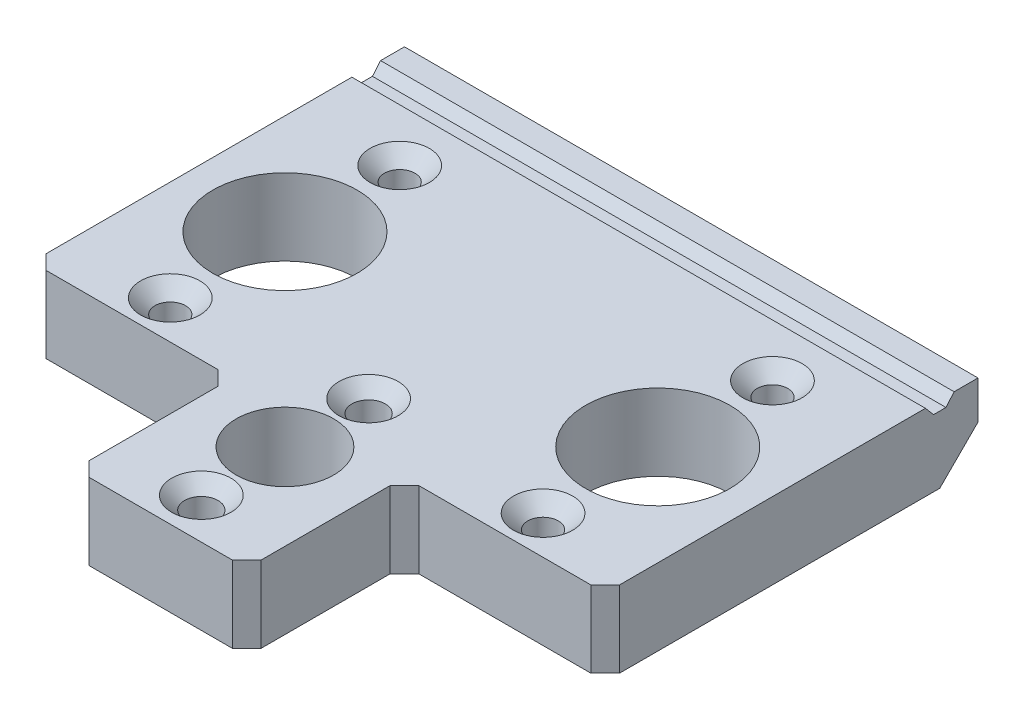
ISO-10303-21;
HEADER;
FILE_DESCRIPTION(('STEP AP214'),'2;1');
FILE_NAME('part.step','',(''),(''),'','','');
FILE_SCHEMA(('AUTOMOTIVE_DESIGN { 1 0 10303 214 1 1 1 1 }'));
ENDSEC;
DATA;
#1=APPLICATION_CONTEXT('core data for automotive mechanical design processes');
#2=APPLICATION_PROTOCOL_DEFINITION('international standard','automotive_design',2000,#1);
#3=PRODUCT_CONTEXT('',#1,'mechanical');
#4=PRODUCT('Part','Part','',(#3));
#5=PRODUCT_RELATED_PRODUCT_CATEGORY('part','',(#4));
#6=PRODUCT_DEFINITION_FORMATION('','',#4);
#7=PRODUCT_DEFINITION_CONTEXT('part definition',#1,'design');
#8=PRODUCT_DEFINITION('design','',#6,#7);
#9=PRODUCT_DEFINITION_SHAPE('','',#8);
#10=(LENGTH_UNIT() NAMED_UNIT(*) SI_UNIT(.MILLI.,.METRE.));
#11=(NAMED_UNIT(*) PLANE_ANGLE_UNIT() SI_UNIT($,.RADIAN.));
#12=(NAMED_UNIT(*) SI_UNIT($,.STERADIAN.) SOLID_ANGLE_UNIT());
#13=UNCERTAINTY_MEASURE_WITH_UNIT(LENGTH_MEASURE(1.E-05),#10,'distance_accuracy_value','');
#14=(GEOMETRIC_REPRESENTATION_CONTEXT(3) GLOBAL_UNCERTAINTY_ASSIGNED_CONTEXT((#13)) GLOBAL_UNIT_ASSIGNED_CONTEXT((#10,
#11,#12)) REPRESENTATION_CONTEXT('',''));
#15=CARTESIAN_POINT('',(0.,0.,0.));
#16=DIRECTION('',(0.,0.,1.));
#17=DIRECTION('',(1.,0.,0.));
#18=AXIS2_PLACEMENT_3D('',#15,#16,#17);
#19=CARTESIAN_POINT('',(0.,8.,0.));
#20=DIRECTION('',(0.,1.,0.));
#21=DIRECTION('',(0.,0.,1.));
#22=AXIS2_PLACEMENT_3D('',#19,#20,#21);
#23=PLANE('',#22);
#24=DIRECTION('',(1.,0.,0.));
#25=VECTOR('',#24,1.);
#26=CARTESIAN_POINT('',(-30.,8.,-17.5));
#27=LINE('',#26,#25);
#28=CARTESIAN_POINT('',(-30.,8.,-17.5));
#29=VERTEX_POINT('',#28);
#30=CARTESIAN_POINT('',(30.,8.,-17.5));
#31=VERTEX_POINT('',#30);
#32=EDGE_CURVE('E293',#29,#31,#27,.T.);
#33=ORIENTED_EDGE('',*,*,#32,.T.);
#34=DIRECTION('',(0.,0.,-1.));
#35=VECTOR('',#34,1.);
#36=CARTESIAN_POINT('',(30.,8.,-20.));
#37=LINE('',#36,#35);
#38=CARTESIAN_POINT('',(30.,8.,-20.));
#39=VERTEX_POINT('',#38);
#40=EDGE_CURVE('E199',#31,#39,#37,.T.);
#41=ORIENTED_EDGE('',*,*,#40,.T.);
#42=DIRECTION('',(-1.,0.,0.));
#43=VECTOR('',#42,1.);
#44=CARTESIAN_POINT('',(-30.,8.,-20.));
#45=LINE('',#44,#43);
#46=CARTESIAN_POINT('',(-30.,8.,-20.));
#47=VERTEX_POINT('',#46);
#48=EDGE_CURVE('E207',#39,#47,#45,.T.);
#49=ORIENTED_EDGE('',*,*,#48,.T.);
#50=DIRECTION('',(0.,0.,1.));
#51=VECTOR('',#50,1.);
#52=CARTESIAN_POINT('',(-30.,8.,-20.));
#53=LINE('',#52,#51);
#54=EDGE_CURVE('E195',#47,#29,#53,.T.);
#55=ORIENTED_EDGE('',*,*,#54,.T.);
#56=EDGE_LOOP('',(#33,#41,#49,#55));
#57=FACE_BOUND('',#56,.T.);
#58=ADVANCED_FACE('F39',(#57),#23,.T.);
#59=DIRECTION('',(1.,0.,0.));
#60=VECTOR('',#59,1.);
#61=CARTESIAN_POINT('',(-30.,8.,-14.5));
#62=LINE('',#61,#60);
#63=CARTESIAN_POINT('',(-30.,8.,-14.5));
#64=VERTEX_POINT('',#63);
#65=CARTESIAN_POINT('',(30.,8.,-14.5));
#66=VERTEX_POINT('',#65);
#67=EDGE_CURVE('E55',#64,#66,#62,.T.);
#68=ORIENTED_EDGE('',*,*,#67,.F.);
#69=CARTESIAN_POINT('',(-30.,8.,17.5));
#70=VERTEX_POINT('',#69);
#71=EDGE_CURVE('E184',#64,#70,#53,.T.);
#72=ORIENTED_EDGE('',*,*,#71,.T.);
#73=DIRECTION('',(0.707106781186548,0.,0.707106781186547));
#74=VECTOR('',#73,1.);
#75=CARTESIAN_POINT('',(-23.75,8.,23.75));
#76=LINE('',#75,#74);
#77=CARTESIAN_POINT('',(-28.5,8.,19.));
#78=VERTEX_POINT('',#77);
#79=EDGE_CURVE('E237',#70,#78,#76,.T.);
#80=ORIENTED_EDGE('',*,*,#79,.T.);
#81=DIRECTION('',(-1.,0.,0.));
#82=VECTOR('',#81,1.);
#83=CARTESIAN_POINT('',(-8.99999999999999,8.,19.));
#84=LINE('',#83,#82);
#85=CARTESIAN_POINT('',(-10.5,8.,19.));
#86=VERTEX_POINT('',#85);
#87=EDGE_CURVE('E358',#86,#78,#84,.T.);
#88=ORIENTED_EDGE('',*,*,#87,.F.);
#89=DIRECTION('',(0.707106781186552,0.,0.707106781186543));
#90=VECTOR('',#89,1.);
#91=CARTESIAN_POINT('',(-10.5,8.,19.));
#92=LINE('',#91,#90);
#93=CARTESIAN_POINT('',(-8.99999999999999,7.99999999999999,20.5));
#94=VERTEX_POINT('',#93);
#95=EDGE_CURVE('E275',#86,#94,#92,.T.);
#96=ORIENTED_EDGE('',*,*,#95,.T.);
#97=DIRECTION('',(0.,0.,-1.));
#98=VECTOR('',#97,1.);
#99=CARTESIAN_POINT('',(-8.99999999999999,7.99999999999999,40.));
#100=LINE('',#99,#98);
#101=CARTESIAN_POINT('',(-8.99999999999999,7.99999999999999,34.));
#102=VERTEX_POINT('',#101);
#103=EDGE_CURVE('E385',#102,#94,#100,.T.);
#104=ORIENTED_EDGE('',*,*,#103,.F.);
#105=DIRECTION('',(0.707106781186546,0.,0.707106781186549));
#106=VECTOR('',#105,1.);
#107=CARTESIAN_POINT('',(-21.5,8.,21.4999999999999));
#108=LINE('',#107,#106);
#109=CARTESIAN_POINT('',(-7.5,7.99999999999999,35.5));
#110=VERTEX_POINT('',#109);
#111=EDGE_CURVE('E235',#102,#110,#108,.T.);
#112=ORIENTED_EDGE('',*,*,#111,.T.);
#113=DIRECTION('',(-1.,0.,0.));
#114=VECTOR('',#113,1.);
#115=CARTESIAN_POINT('',(8.99999999999999,7.99999999999999,35.5));
#116=LINE('',#115,#114);
#117=CARTESIAN_POINT('',(7.5,7.99999999999999,35.5));
#118=VERTEX_POINT('',#117);
#119=EDGE_CURVE('E347',#118,#110,#116,.T.);
#120=ORIENTED_EDGE('',*,*,#119,.F.);
#121=DIRECTION('',(0.707106781186546,0.,-0.707106781186549));
#122=VECTOR('',#121,1.);
#123=CARTESIAN_POINT('',(21.5,8.,21.4999999999999));
#124=LINE('',#123,#122);
#125=CARTESIAN_POINT('',(8.99999999999999,7.99999999999999,34.));
#126=VERTEX_POINT('',#125);
#127=EDGE_CURVE('E233',#118,#126,#124,.T.);
#128=ORIENTED_EDGE('',*,*,#127,.T.);
#129=DIRECTION('',(0.,0.,-1.));
#130=VECTOR('',#129,1.);
#131=CARTESIAN_POINT('',(8.99999999999999,7.99999999999999,40.));
#132=LINE('',#131,#130);
#133=CARTESIAN_POINT('',(8.99999999999999,7.99999999999999,20.5));
#134=VERTEX_POINT('',#133);
#135=EDGE_CURVE('E375',#126,#134,#132,.T.);
#136=ORIENTED_EDGE('',*,*,#135,.T.);
#137=DIRECTION('',(0.707106781186552,0.,-0.707106781186543));
#138=VECTOR('',#137,1.);
#139=CARTESIAN_POINT('',(10.5,8.,19.));
#140=LINE('',#139,#138);
#141=CARTESIAN_POINT('',(10.5,8.,19.));
#142=VERTEX_POINT('',#141);
#143=EDGE_CURVE('E273',#134,#142,#140,.T.);
#144=ORIENTED_EDGE('',*,*,#143,.T.);
#145=DIRECTION('',(-1.,0.,0.));
#146=VECTOR('',#145,1.);
#147=CARTESIAN_POINT('',(30.,8.,19.));
#148=LINE('',#147,#146);
#149=CARTESIAN_POINT('',(28.5,8.,19.));
#150=VERTEX_POINT('',#149);
#151=EDGE_CURVE('E354',#150,#142,#148,.T.);
#152=ORIENTED_EDGE('',*,*,#151,.F.);
#153=DIRECTION('',(0.707106781186545,0.,-0.70710678118655));
#154=VECTOR('',#153,1.);
#155=CARTESIAN_POINT('',(23.7500000000001,8.,23.7499999999999));
#156=LINE('',#155,#154);
#157=CARTESIAN_POINT('',(30.,8.,17.5));
#158=VERTEX_POINT('',#157);
#159=EDGE_CURVE('E239',#150,#158,#156,.T.);
#160=ORIENTED_EDGE('',*,*,#159,.T.);
#161=EDGE_CURVE('E187',#158,#66,#37,.T.);
#162=ORIENTED_EDGE('',*,*,#161,.T.);
#163=EDGE_LOOP('',(#68,#72,#80,#88,#96,#104,#112,#120,#128,#136,#144,#152,#160,#162));
#164=FACE_BOUND('',#163,.T.);
#165=CARTESIAN_POINT('',(0.,8.,31.25));
#166=DIRECTION('',(0.,1.,0.));
#167=DIRECTION('',(0.,0.,1.));
#168=AXIS2_PLACEMENT_3D('',#165,#166,#167);
#169=CIRCLE('',#168,3.1);
#170=CARTESIAN_POINT('',(0.,8.,34.35));
#171=VERTEX_POINT('',#170);
#172=EDGE_CURVE('E295',#171,#171,#169,.T.);
#173=ORIENTED_EDGE('',*,*,#172,.F.);
#174=EDGE_LOOP('',(#173));
#175=FACE_BOUND('',#174,.T.);
#176=CARTESIAN_POINT('',(0.,8.,13.75));
#177=DIRECTION('',(0.,1.,0.));
#178=DIRECTION('',(0.,0.,1.));
#179=AXIS2_PLACEMENT_3D('',#176,#177,#178);
#180=CIRCLE('',#179,3.1);
#181=CARTESIAN_POINT('',(0.,8.,16.85));
#182=VERTEX_POINT('',#181);
#183=EDGE_CURVE('E305',#182,#182,#180,.T.);
#184=ORIENTED_EDGE('',*,*,#183,.F.);
#185=EDGE_LOOP('',(#184));
#186=FACE_BOUND('',#185,.T.);
#187=CARTESIAN_POINT('',(19.5,8.,-9.));
#188=DIRECTION('',(0.,1.,0.));
#189=DIRECTION('',(0.,0.,1.));
#190=AXIS2_PLACEMENT_3D('',#187,#188,#189);
#191=CIRCLE('',#190,3.1);
#192=CARTESIAN_POINT('',(19.5,8.,-5.9));
#193=VERTEX_POINT('',#192);
#194=EDGE_CURVE('E311',#193,#193,#191,.T.);
#195=ORIENTED_EDGE('',*,*,#194,.F.);
#196=EDGE_LOOP('',(#195));
#197=FACE_BOUND('',#196,.T.);
#198=CARTESIAN_POINT('',(19.5,8.,15.));
#199=DIRECTION('',(0.,1.,0.));
#200=DIRECTION('',(0.,0.,1.));
#201=AXIS2_PLACEMENT_3D('',#198,#199,#200);
#202=CIRCLE('',#201,3.1);
#203=CARTESIAN_POINT('',(19.5,8.,18.1));
#204=VERTEX_POINT('',#203);
#205=EDGE_CURVE('E320',#204,#204,#202,.T.);
#206=ORIENTED_EDGE('',*,*,#205,.F.);
#207=EDGE_LOOP('',(#206));
#208=FACE_BOUND('',#207,.T.);
#209=CARTESIAN_POINT('',(-19.5,8.,15.));
#210=DIRECTION('',(0.,1.,0.));
#211=DIRECTION('',(0.,0.,1.));
#212=AXIS2_PLACEMENT_3D('',#209,#210,#211);
#213=CIRCLE('',#212,3.1);
#214=CARTESIAN_POINT('',(-19.5,8.,18.1));
#215=VERTEX_POINT('',#214);
#216=EDGE_CURVE('E329',#215,#215,#213,.T.);
#217=ORIENTED_EDGE('',*,*,#216,.F.);
#218=EDGE_LOOP('',(#217));
#219=FACE_BOUND('',#218,.T.);
#220=CARTESIAN_POINT('',(-19.5,8.,-9.));
#221=DIRECTION('',(0.,1.,0.));
#222=DIRECTION('',(0.,0.,1.));
#223=AXIS2_PLACEMENT_3D('',#220,#221,#222);
#224=CIRCLE('',#223,3.1);
#225=CARTESIAN_POINT('',(-19.5,8.,-5.9));
#226=VERTEX_POINT('',#225);
#227=EDGE_CURVE('E338',#226,#226,#224,.T.);
#228=ORIENTED_EDGE('',*,*,#227,.F.);
#229=EDGE_LOOP('',(#228));
#230=FACE_BOUND('',#229,.T.);
#231=CARTESIAN_POINT('',(0.,8.,22.5));
#232=DIRECTION('',(0.,1.,0.));
#233=DIRECTION('',(0.,0.,1.));
#234=AXIS2_PLACEMENT_3D('',#231,#232,#233);
#235=CIRCLE('',#234,5.1);
#236=CARTESIAN_POINT('',(0.,8.,27.6));
#237=VERTEX_POINT('',#236);
#238=EDGE_CURVE('E369',#237,#237,#235,.T.);
#239=ORIENTED_EDGE('',*,*,#238,.F.);
#240=EDGE_LOOP('',(#239));
#241=FACE_BOUND('',#240,.T.);
#242=CARTESIAN_POINT('',(-19.5,8.,3.));
#243=DIRECTION('',(0.,1.,0.));
#244=DIRECTION('',(0.,0.,1.));
#245=AXIS2_PLACEMENT_3D('',#242,#243,#244);
#246=CIRCLE('',#245,7.55);
#247=CARTESIAN_POINT('',(-19.5,8.,10.55));
#248=VERTEX_POINT('',#247);
#249=EDGE_CURVE('E210',#248,#248,#246,.T.);
#250=ORIENTED_EDGE('',*,*,#249,.F.);
#251=EDGE_LOOP('',(#250));
#252=FACE_BOUND('',#251,.T.);
#253=CARTESIAN_POINT('',(19.5,8.,3.));
#254=DIRECTION('',(0.,1.,0.));
#255=DIRECTION('',(0.,0.,-1.));
#256=AXIS2_PLACEMENT_3D('',#253,#254,#255);
#257=CIRCLE('',#256,7.55);
#258=CARTESIAN_POINT('',(19.5,8.,-4.55));
#259=VERTEX_POINT('',#258);
#260=EDGE_CURVE('E389',#259,#259,#257,.T.);
#261=ORIENTED_EDGE('',*,*,#260,.F.);
#262=EDGE_LOOP('',(#261));
#263=FACE_BOUND('',#262,.T.);
#264=ADVANCED_FACE('F182',(#164,#175,#186,#197,#208,#219,#230,#241,#252,#263),#23,.T.);
#265=CARTESIAN_POINT('',(0.,0.,0.));
#266=DIRECTION('',(0.,1.,0.));
#267=DIRECTION('',(0.,0.,1.));
#268=AXIS2_PLACEMENT_3D('',#265,#266,#267);
#269=PLANE('',#268);
#270=CARTESIAN_POINT('',(19.5,0.,-9.));
#271=DIRECTION('',(0.,1.,0.));
#272=DIRECTION('',(0.,0.,1.));
#273=AXIS2_PLACEMENT_3D('',#270,#271,#272);
#274=CIRCLE('',#273,1.6);
#275=CARTESIAN_POINT('',(19.5,0.,-7.4));
#276=VERTEX_POINT('',#275);
#277=EDGE_CURVE('E317',#276,#276,#274,.T.);
#278=ORIENTED_EDGE('',*,*,#277,.T.);
#279=EDGE_LOOP('',(#278));
#280=FACE_BOUND('',#279,.T.);
#281=CARTESIAN_POINT('',(19.5,0.,15.));
#282=DIRECTION('',(0.,1.,0.));
#283=DIRECTION('',(0.,0.,1.));
#284=AXIS2_PLACEMENT_3D('',#281,#282,#283);
#285=CIRCLE('',#284,1.6);
#286=CARTESIAN_POINT('',(19.5,0.,16.6));
#287=VERTEX_POINT('',#286);
#288=EDGE_CURVE('E326',#287,#287,#285,.T.);
#289=ORIENTED_EDGE('',*,*,#288,.T.);
#290=EDGE_LOOP('',(#289));
#291=FACE_BOUND('',#290,.T.);
#292=CARTESIAN_POINT('',(-19.5,0.,15.));
#293=DIRECTION('',(0.,1.,0.));
#294=DIRECTION('',(0.,0.,1.));
#295=AXIS2_PLACEMENT_3D('',#292,#293,#294);
#296=CIRCLE('',#295,1.6);
#297=CARTESIAN_POINT('',(-19.5,0.,16.6));
#298=VERTEX_POINT('',#297);
#299=EDGE_CURVE('E335',#298,#298,#296,.T.);
#300=ORIENTED_EDGE('',*,*,#299,.T.);
#301=EDGE_LOOP('',(#300));
#302=FACE_BOUND('',#301,.T.);
#303=CARTESIAN_POINT('',(-19.5,0.,-9.));
#304=DIRECTION('',(0.,1.,0.));
#305=DIRECTION('',(0.,0.,1.));
#306=AXIS2_PLACEMENT_3D('',#303,#304,#305);
#307=CIRCLE('',#306,1.6);
#308=CARTESIAN_POINT('',(-19.5,0.,-7.4));
#309=VERTEX_POINT('',#308);
#310=EDGE_CURVE('E344',#309,#309,#307,.T.);
#311=ORIENTED_EDGE('',*,*,#310,.T.);
#312=EDGE_LOOP('',(#311));
#313=FACE_BOUND('',#312,.T.);
#314=CARTESIAN_POINT('',(19.5,0.,3.));
#315=DIRECTION('',(0.,1.,0.));
#316=DIRECTION('',(0.,0.,-1.));
#317=AXIS2_PLACEMENT_3D('',#314,#315,#316);
#318=CIRCLE('',#317,7.55);
#319=CARTESIAN_POINT('',(19.5,0.,-4.55));
#320=VERTEX_POINT('',#319);
#321=EDGE_CURVE('E388',#320,#320,#318,.T.);
#322=ORIENTED_EDGE('',*,*,#321,.T.);
#323=EDGE_LOOP('',(#322));
#324=FACE_BOUND('',#323,.T.);
#325=CARTESIAN_POINT('',(-19.5,0.,3.));
#326=DIRECTION('',(0.,1.,0.));
#327=DIRECTION('',(0.,0.,1.));
#328=AXIS2_PLACEMENT_3D('',#325,#326,#327);
#329=CIRCLE('',#328,7.55);
#330=CARTESIAN_POINT('',(-19.5,0.,10.55));
#331=VERTEX_POINT('',#330);
#332=EDGE_CURVE('E204',#331,#331,#329,.T.);
#333=ORIENTED_EDGE('',*,*,#332,.T.);
#334=EDGE_LOOP('',(#333));
#335=FACE_BOUND('',#334,.T.);
#336=CARTESIAN_POINT('',(0.,0.,22.5));
#337=DIRECTION('',(0.,1.,0.));
#338=DIRECTION('',(0.,0.,1.));
#339=AXIS2_PLACEMENT_3D('',#336,#337,#338);
#340=CIRCLE('',#339,5.1);
#341=CARTESIAN_POINT('',(0.,0.,27.6));
#342=VERTEX_POINT('',#341);
#343=EDGE_CURVE('E372',#342,#342,#340,.T.);
#344=ORIENTED_EDGE('',*,*,#343,.T.);
#345=EDGE_LOOP('',(#344));
#346=FACE_BOUND('',#345,.T.);
#347=CARTESIAN_POINT('',(0.,0.,13.75));
#348=DIRECTION('',(0.,1.,0.));
#349=DIRECTION('',(0.,0.,1.));
#350=AXIS2_PLACEMENT_3D('',#347,#348,#349);
#351=CIRCLE('',#350,1.75);
#352=CARTESIAN_POINT('',(0.,0.,15.5));
#353=VERTEX_POINT('',#352);
#354=EDGE_CURVE('E366',#353,#353,#351,.T.);
#355=ORIENTED_EDGE('',*,*,#354,.T.);
#356=EDGE_LOOP('',(#355));
#357=FACE_BOUND('',#356,.T.);
#358=CARTESIAN_POINT('',(0.,0.,31.25));
#359=DIRECTION('',(0.,1.,0.));
#360=DIRECTION('',(0.,0.,1.));
#361=AXIS2_PLACEMENT_3D('',#358,#359,#360);
#362=CIRCLE('',#361,1.75);
#363=CARTESIAN_POINT('',(0.,0.,33.));
#364=VERTEX_POINT('',#363);
#365=EDGE_CURVE('E361',#364,#364,#362,.T.);
#366=ORIENTED_EDGE('',*,*,#365,.T.);
#367=EDGE_LOOP('',(#366));
#368=FACE_BOUND('',#367,.T.);
#369=DIRECTION('',(0.,0.,-1.));
#370=VECTOR('',#369,1.);
#371=CARTESIAN_POINT('',(30.,0.,-20.));
#372=LINE('',#371,#370);
#373=CARTESIAN_POINT('',(30.,0.,17.5));
#374=VERTEX_POINT('',#373);
#375=CARTESIAN_POINT('',(30.,0.,-16.));
#376=VERTEX_POINT('',#375);
#377=EDGE_CURVE('E196',#374,#376,#372,.T.);
#378=ORIENTED_EDGE('',*,*,#377,.F.);
#379=DIRECTION('',(-0.707106781186545,0.,0.70710678118655));
#380=VECTOR('',#379,1.);
#381=CARTESIAN_POINT('',(28.5,0.,19.));
#382=LINE('',#381,#380);
#383=CARTESIAN_POINT('',(28.5,0.,19.));
#384=VERTEX_POINT('',#383);
#385=EDGE_CURVE('E249',#374,#384,#382,.T.);
#386=ORIENTED_EDGE('',*,*,#385,.T.);
#387=DIRECTION('',(1.,0.,0.));
#388=VECTOR('',#387,1.);
#389=CARTESIAN_POINT('',(8.99999999999999,0.,19.));
#390=LINE('',#389,#388);
#391=CARTESIAN_POINT('',(10.5,0.,19.));
#392=VERTEX_POINT('',#391);
#393=EDGE_CURVE('E357',#392,#384,#390,.T.);
#394=ORIENTED_EDGE('',*,*,#393,.F.);
#395=DIRECTION('',(-0.707106781186552,0.,0.707106781186543));
#396=VECTOR('',#395,1.);
#397=CARTESIAN_POINT('',(14.7499999999999,0.,14.7500000000001));
#398=LINE('',#397,#396);
#399=CARTESIAN_POINT('',(8.99999999999999,0.,20.5));
#400=VERTEX_POINT('',#399);
#401=EDGE_CURVE('E63',#392,#400,#398,.T.);
#402=ORIENTED_EDGE('',*,*,#401,.T.);
#403=DIRECTION('',(0.,0.,-1.));
#404=VECTOR('',#403,1.);
#405=CARTESIAN_POINT('',(8.99999999999999,0.,40.));
#406=LINE('',#405,#404);
#407=CARTESIAN_POINT('',(8.99999999999999,0.,34.));
#408=VERTEX_POINT('',#407);
#409=EDGE_CURVE('E380',#408,#400,#406,.T.);
#410=ORIENTED_EDGE('',*,*,#409,.F.);
#411=DIRECTION('',(-0.707106781186546,0.,0.707106781186549));
#412=VECTOR('',#411,1.);
#413=CARTESIAN_POINT('',(7.5,0.,35.5));
#414=LINE('',#413,#412);
#415=CARTESIAN_POINT('',(7.5,0.,35.5));
#416=VERTEX_POINT('',#415);
#417=EDGE_CURVE('E243',#408,#416,#414,.T.);
#418=ORIENTED_EDGE('',*,*,#417,.T.);
#419=DIRECTION('',(1.,0.,0.));
#420=VECTOR('',#419,1.);
#421=CARTESIAN_POINT('',(-8.99999999999999,0.,35.5));
#422=LINE('',#421,#420);
#423=CARTESIAN_POINT('',(-7.5,0.,35.5));
#424=VERTEX_POINT('',#423);
#425=EDGE_CURVE('E350',#424,#416,#422,.T.);
#426=ORIENTED_EDGE('',*,*,#425,.F.);
#427=DIRECTION('',(-0.707106781186546,0.,-0.707106781186549));
#428=VECTOR('',#427,1.);
#429=CARTESIAN_POINT('',(-7.5,0.,35.5));
#430=LINE('',#429,#428);
#431=CARTESIAN_POINT('',(-8.99999999999999,0.,34.));
#432=VERTEX_POINT('',#431);
#433=EDGE_CURVE('E245',#424,#432,#430,.T.);
#434=ORIENTED_EDGE('',*,*,#433,.T.);
#435=DIRECTION('',(0.,0.,-1.));
#436=VECTOR('',#435,1.);
#437=CARTESIAN_POINT('',(-8.99999999999999,0.,40.));
#438=LINE('',#437,#436);
#439=CARTESIAN_POINT('',(-8.99999999999999,0.,20.5));
#440=VERTEX_POINT('',#439);
#441=EDGE_CURVE('E382',#432,#440,#438,.T.);
#442=ORIENTED_EDGE('',*,*,#441,.T.);
#443=DIRECTION('',(-0.707106781186552,0.,-0.707106781186543));
#444=VECTOR('',#443,1.);
#445=CARTESIAN_POINT('',(-14.7499999999999,0.,14.7500000000001));
#446=LINE('',#445,#444);
#447=CARTESIAN_POINT('',(-10.5,0.,19.));
#448=VERTEX_POINT('',#447);
#449=EDGE_CURVE('E277',#440,#448,#446,.T.);
#450=ORIENTED_EDGE('',*,*,#449,.T.);
#451=DIRECTION('',(1.,0.,0.));
#452=VECTOR('',#451,1.);
#453=CARTESIAN_POINT('',(-30.,0.,19.));
#454=LINE('',#453,#452);
#455=CARTESIAN_POINT('',(-28.5,0.,19.));
#456=VERTEX_POINT('',#455);
#457=EDGE_CURVE('E353',#456,#448,#454,.T.);
#458=ORIENTED_EDGE('',*,*,#457,.F.);
#459=DIRECTION('',(-0.707106781186548,0.,-0.707106781186547));
#460=VECTOR('',#459,1.);
#461=CARTESIAN_POINT('',(-28.5,0.,19.));
#462=LINE('',#461,#460);
#463=CARTESIAN_POINT('',(-30.,0.,17.5));
#464=VERTEX_POINT('',#463);
#465=EDGE_CURVE('E247',#456,#464,#462,.T.);
#466=ORIENTED_EDGE('',*,*,#465,.T.);
#467=DIRECTION('',(0.,0.,1.));
#468=VECTOR('',#467,1.);
#469=CARTESIAN_POINT('',(-30.,0.,-20.));
#470=LINE('',#469,#468);
#471=CARTESIAN_POINT('',(-30.,0.,-16.));
#472=VERTEX_POINT('',#471);
#473=EDGE_CURVE('E200',#472,#464,#470,.T.);
#474=ORIENTED_EDGE('',*,*,#473,.F.);
#475=DIRECTION('',(1.,0.,0.));
#476=VECTOR('',#475,1.);
#477=CARTESIAN_POINT('',(0.,0.,-16.));
#478=LINE('',#477,#476);
#479=EDGE_CURVE('E222',#472,#376,#478,.T.);
#480=ORIENTED_EDGE('',*,*,#479,.T.);
#481=EDGE_LOOP('',(#378,#386,#394,#402,#410,#418,#426,#434,#442,#450,#458,#466,#474,#480));
#482=FACE_BOUND('',#481,.T.);
#483=ADVANCED_FACE('F399',(#280,#291,#302,#313,#324,#335,#346,#357,#368,#482),#269,.F.);
#484=CARTESIAN_POINT('',(-8.99999999999999,7.99999999999999,40.));
#485=DIRECTION('',(1.,0.,0.));
#486=DIRECTION('',(0.,0.,-1.));
#487=AXIS2_PLACEMENT_3D('',#484,#485,#486);
#488=PLANE('',#487);
#489=ORIENTED_EDGE('',*,*,#441,.F.);
#490=DIRECTION('',(0.,1.,0.));
#491=VECTOR('',#490,1.);
#492=CARTESIAN_POINT('',(-8.99999999999999,7.99999999999999,34.));
#493=LINE('',#492,#491);
#494=EDGE_CURVE('E266',#432,#102,#493,.T.);
#495=ORIENTED_EDGE('',*,*,#494,.T.);
#496=ORIENTED_EDGE('',*,*,#103,.T.);
#497=DIRECTION('',(0.,-1.,0.));
#498=VECTOR('',#497,1.);
#499=CARTESIAN_POINT('',(-8.99999999999999,7.99999999999999,20.5));
#500=LINE('',#499,#498);
#501=EDGE_CURVE('E264',#94,#440,#500,.T.);
#502=ORIENTED_EDGE('',*,*,#501,.T.);
#503=EDGE_LOOP('',(#489,#495,#496,#502));
#504=FACE_BOUND('',#503,.T.);
#505=ADVANCED_FACE('F424',(#504),#488,.F.);
#506=CARTESIAN_POINT('',(8.99999999999999,7.99999999999999,40.));
#507=DIRECTION('',(-1.,0.,0.));
#508=DIRECTION('',(0.,0.,1.));
#509=AXIS2_PLACEMENT_3D('',#506,#507,#508);
#510=PLANE('',#509);
#511=ORIENTED_EDGE('',*,*,#135,.F.);
#512=DIRECTION('',(0.,-1.,0.));
#513=VECTOR('',#512,1.);
#514=CARTESIAN_POINT('',(8.99999999999999,0.,34.));
#515=LINE('',#514,#513);
#516=EDGE_CURVE('E270',#126,#408,#515,.T.);
#517=ORIENTED_EDGE('',*,*,#516,.T.);
#518=ORIENTED_EDGE('',*,*,#409,.T.);
#519=DIRECTION('',(0.,1.,0.));
#520=VECTOR('',#519,1.);
#521=CARTESIAN_POINT('',(8.99999999999999,7.99999999999999,20.5));
#522=LINE('',#521,#520);
#523=EDGE_CURVE('E268',#400,#134,#522,.T.);
#524=ORIENTED_EDGE('',*,*,#523,.T.);
#525=EDGE_LOOP('',(#511,#517,#518,#524));
#526=FACE_BOUND('',#525,.T.);
#527=ADVANCED_FACE('F431',(#526),#510,.F.);
#528=CARTESIAN_POINT('',(-30.,8.,-20.));
#529=DIRECTION('',(1.,0.,0.));
#530=DIRECTION('',(0.,0.,-1.));
#531=AXIS2_PLACEMENT_3D('',#528,#529,#530);
#532=PLANE('',#531);
#533=DIRECTION('',(0.,0.,-1.));
#534=VECTOR('',#533,1.);
#535=CARTESIAN_POINT('',(-30.,7.,-15.35));
#536=LINE('',#535,#534);
#537=CARTESIAN_POINT('',(-30.,7.,-15.35));
#538=VERTEX_POINT('',#537);
#539=CARTESIAN_POINT('',(-30.,7.,-16.65));
#540=VERTEX_POINT('',#539);
#541=EDGE_CURVE('E178',#538,#540,#536,.T.);
#542=ORIENTED_EDGE('',*,*,#541,.T.);
#543=DIRECTION('',(0.,0.761939317759461,-0.647648420095539));
#544=VECTOR('',#543,1.);
#545=CARTESIAN_POINT('',(-30.,7.,-16.65));
#546=LINE('',#545,#544);
#547=EDGE_CURVE('E188',#540,#29,#546,.T.);
#548=ORIENTED_EDGE('',*,*,#547,.T.);
#549=ORIENTED_EDGE('',*,*,#54,.F.);
#550=DIRECTION('',(0.,-1.,0.));
#551=VECTOR('',#550,1.);
#552=CARTESIAN_POINT('',(-30.,8.,-20.));
#553=LINE('',#552,#551);
#554=CARTESIAN_POINT('',(-30.,4.00000000000001,-20.));
#555=VERTEX_POINT('',#554);
#556=EDGE_CURVE('E209',#47,#555,#553,.T.);
#557=ORIENTED_EDGE('',*,*,#556,.T.);
#558=DIRECTION('',(0.,0.707106781186546,-0.707106781186549));
#559=VECTOR('',#558,1.);
#560=CARTESIAN_POINT('',(-30.,4.00000000000001,-20.));
#561=LINE('',#560,#559);
#562=EDGE_CURVE('E220',#555,#472,#561,.F.);
#563=ORIENTED_EDGE('',*,*,#562,.T.);
#564=ORIENTED_EDGE('',*,*,#473,.T.);
#565=DIRECTION('',(0.,1.,0.));
#566=VECTOR('',#565,1.);
#567=CARTESIAN_POINT('',(-30.,8.,17.5));
#568=LINE('',#567,#566);
#569=EDGE_CURVE('E193',#464,#70,#568,.T.);
#570=ORIENTED_EDGE('',*,*,#569,.T.);
#571=ORIENTED_EDGE('',*,*,#71,.F.);
#572=DIRECTION('',(0.,-0.761939317759459,-0.64764842009554));
#573=VECTOR('',#572,1.);
#574=CARTESIAN_POINT('',(-30.,8.,-14.5));
#575=LINE('',#574,#573);
#576=EDGE_CURVE('E170',#64,#538,#575,.T.);
#577=ORIENTED_EDGE('',*,*,#576,.T.);
#578=EDGE_LOOP('',(#542,#548,#549,#557,#563,#564,#570,#571,#577));
#579=FACE_BOUND('',#578,.T.);
#580=ADVANCED_FACE('F190',(#579),#532,.F.);
#581=CARTESIAN_POINT('',(30.,8.,-20.));
#582=DIRECTION('',(-1.,0.,0.));
#583=DIRECTION('',(0.,0.,1.));
#584=AXIS2_PLACEMENT_3D('',#581,#582,#583);
#585=PLANE('',#584);
#586=ORIENTED_EDGE('',*,*,#40,.F.);
#587=DIRECTION('',(0.,-0.761939317759461,0.647648420095539));
#588=VECTOR('',#587,1.);
#589=CARTESIAN_POINT('',(30.,9.23367198838897,-18.5486211901306));
#590=LINE('',#589,#588);
#591=CARTESIAN_POINT('',(30.,7.,-16.65));
#592=VERTEX_POINT('',#591);
#593=EDGE_CURVE('E11',#31,#592,#590,.T.);
#594=ORIENTED_EDGE('',*,*,#593,.T.);
#595=DIRECTION('',(0.,0.,1.));
#596=VECTOR('',#595,1.);
#597=CARTESIAN_POINT('',(30.,7.,-20.));
#598=LINE('',#597,#596);
#599=CARTESIAN_POINT('',(30.,7.,-15.35));
#600=VERTEX_POINT('',#599);
#601=EDGE_CURVE('E48',#592,#600,#598,.T.);
#602=ORIENTED_EDGE('',*,*,#601,.T.);
#603=DIRECTION('',(0.,0.761939317759459,0.64764842009554));
#604=VECTOR('',#603,1.);
#605=CARTESIAN_POINT('',(30.,5.28592162554427,-16.8069666182874));
#606=LINE('',#605,#604);
#607=EDGE_CURVE('E279',#600,#66,#606,.T.);
#608=ORIENTED_EDGE('',*,*,#607,.T.);
#609=ORIENTED_EDGE('',*,*,#161,.F.);
#610=DIRECTION('',(0.,-1.,0.));
#611=VECTOR('',#610,1.);
#612=CARTESIAN_POINT('',(30.,0.,17.5));
#613=LINE('',#612,#611);
#614=EDGE_CURVE('E241',#158,#374,#613,.T.);
#615=ORIENTED_EDGE('',*,*,#614,.T.);
#616=ORIENTED_EDGE('',*,*,#377,.T.);
#617=DIRECTION('',(0.,-0.707106781186546,0.707106781186549));
#618=VECTOR('',#617,1.);
#619=CARTESIAN_POINT('',(30.,4.00000000000001,-20.));
#620=LINE('',#619,#618);
#621=CARTESIAN_POINT('',(30.,4.00000000000001,-20.));
#622=VERTEX_POINT('',#621);
#623=EDGE_CURVE('E225',#376,#622,#620,.F.);
#624=ORIENTED_EDGE('',*,*,#623,.T.);
#625=DIRECTION('',(0.,-1.,0.));
#626=VECTOR('',#625,1.);
#627=CARTESIAN_POINT('',(30.,8.,-20.));
#628=LINE('',#627,#626);
#629=EDGE_CURVE('E214',#39,#622,#628,.T.);
#630=ORIENTED_EDGE('',*,*,#629,.F.);
#631=EDGE_LOOP('',(#586,#594,#602,#608,#609,#615,#616,#624,#630));
#632=FACE_BOUND('',#631,.T.);
#633=ADVANCED_FACE('F283',(#632),#585,.F.);
#634=CARTESIAN_POINT('',(-30.,8.,-20.));
#635=DIRECTION('',(0.,0.,1.));
#636=DIRECTION('',(1.,0.,0.));
#637=AXIS2_PLACEMENT_3D('',#634,#635,#636);
#638=PLANE('',#637);
#639=ORIENTED_EDGE('',*,*,#629,.T.);
#640=DIRECTION('',(-1.,0.,0.));
#641=VECTOR('',#640,1.);
#642=CARTESIAN_POINT('',(-30.,4.00000000000001,-20.));
#643=LINE('',#642,#641);
#644=EDGE_CURVE('E217',#622,#555,#643,.T.);
#645=ORIENTED_EDGE('',*,*,#644,.T.);
#646=ORIENTED_EDGE('',*,*,#556,.F.);
#647=ORIENTED_EDGE('',*,*,#48,.F.);
#648=EDGE_LOOP('',(#639,#645,#646,#647));
#649=FACE_BOUND('',#648,.T.);
#650=ADVANCED_FACE('F405',(#649),#638,.F.);
#651=CARTESIAN_POINT('',(-19.5,8.,3.));
#652=DIRECTION('',(0.,-1.,0.));
#653=DIRECTION('',(0.,0.,-1.));
#654=AXIS2_PLACEMENT_3D('',#651,#652,#653);
#655=CYLINDRICAL_SURFACE('',#654,7.55);
#656=ORIENTED_EDGE('',*,*,#249,.T.);
#657=EDGE_LOOP('',(#656));
#658=FACE_BOUND('',#657,.T.);
#659=ORIENTED_EDGE('',*,*,#332,.F.);
#660=EDGE_LOOP('',(#659));
#661=FACE_BOUND('',#660,.T.);
#662=ADVANCED_FACE('F402',(#658,#661),#655,.F.);
#663=CARTESIAN_POINT('',(19.5,8.,3.));
#664=DIRECTION('',(0.,-1.,0.));
#665=DIRECTION('',(0.,0.,-1.));
#666=AXIS2_PLACEMENT_3D('',#663,#664,#665);
#667=CYLINDRICAL_SURFACE('',#666,7.55);
#668=ORIENTED_EDGE('',*,*,#260,.T.);
#669=EDGE_LOOP('',(#668));
#670=FACE_BOUND('',#669,.T.);
#671=ORIENTED_EDGE('',*,*,#321,.F.);
#672=EDGE_LOOP('',(#671));
#673=FACE_BOUND('',#672,.T.);
#674=ADVANCED_FACE('F404',(#670,#673),#667,.F.);
#675=CARTESIAN_POINT('',(-30.,4.00000000000001,-20.));
#676=DIRECTION('',(0.,0.707106781186549,0.707106781186546));
#677=DIRECTION('',(-1.,0.,0.));
#678=AXIS2_PLACEMENT_3D('',#675,#676,#677);
#679=PLANE('',#678);
#680=ORIENTED_EDGE('',*,*,#623,.F.);
#681=ORIENTED_EDGE('',*,*,#479,.F.);
#682=ORIENTED_EDGE('',*,*,#562,.F.);
#683=ORIENTED_EDGE('',*,*,#644,.F.);
#684=EDGE_LOOP('',(#680,#681,#682,#683));
#685=FACE_BOUND('',#684,.T.);
#686=ADVANCED_FACE('F411',(#685),#679,.F.);
#687=CARTESIAN_POINT('',(0.,0.,22.5));
#688=DIRECTION('',(0.,1.,0.));
#689=DIRECTION('',(0.,0.,1.));
#690=AXIS2_PLACEMENT_3D('',#687,#688,#689);
#691=CYLINDRICAL_SURFACE('',#690,5.1);
#692=ORIENTED_EDGE('',*,*,#343,.F.);
#693=EDGE_LOOP('',(#692));
#694=FACE_BOUND('',#693,.T.);
#695=ORIENTED_EDGE('',*,*,#238,.T.);
#696=EDGE_LOOP('',(#695));
#697=FACE_BOUND('',#696,.T.);
#698=ADVANCED_FACE('F438',(#694,#697),#691,.F.);
#699=CARTESIAN_POINT('',(0.,0.,13.75));
#700=DIRECTION('',(0.,1.,0.));
#701=DIRECTION('',(0.,0.,1.));
#702=AXIS2_PLACEMENT_3D('',#699,#700,#701);
#703=CYLINDRICAL_SURFACE('',#702,1.75);
#704=CARTESIAN_POINT('',(0.,6.65,13.75));
#705=DIRECTION('',(0.,1.,0.));
#706=DIRECTION('',(0.,0.,1.));
#707=AXIS2_PLACEMENT_3D('',#704,#705,#706);
#708=CIRCLE('',#707,1.75);
#709=CARTESIAN_POINT('',(0.,6.65,15.5));
#710=VERTEX_POINT('',#709);
#711=EDGE_CURVE('E308',#710,#710,#708,.T.);
#712=ORIENTED_EDGE('',*,*,#711,.T.);
#713=EDGE_LOOP('',(#712));
#714=FACE_BOUND('',#713,.T.);
#715=ORIENTED_EDGE('',*,*,#354,.F.);
#716=EDGE_LOOP('',(#715));
#717=FACE_BOUND('',#716,.T.);
#718=ADVANCED_FACE('F528',(#714,#717),#703,.F.);
#719=CARTESIAN_POINT('',(0.,0.,31.25));
#720=DIRECTION('',(0.,1.,0.));
#721=DIRECTION('',(0.,0.,1.));
#722=AXIS2_PLACEMENT_3D('',#719,#720,#721);
#723=CYLINDRICAL_SURFACE('',#722,1.75);
#724=CARTESIAN_POINT('',(0.,6.65,31.25));
#725=DIRECTION('',(0.,1.,0.));
#726=DIRECTION('',(0.,0.,1.));
#727=AXIS2_PLACEMENT_3D('',#724,#725,#726);
#728=CIRCLE('',#727,1.75);
#729=CARTESIAN_POINT('',(0.,6.65,33.));
#730=VERTEX_POINT('',#729);
#731=EDGE_CURVE('E302',#730,#730,#728,.T.);
#732=ORIENTED_EDGE('',*,*,#731,.T.);
#733=EDGE_LOOP('',(#732));
#734=FACE_BOUND('',#733,.T.);
#735=ORIENTED_EDGE('',*,*,#365,.F.);
#736=EDGE_LOOP('',(#735));
#737=FACE_BOUND('',#736,.T.);
#738=ADVANCED_FACE('F530',(#734,#737),#723,.F.);
#739=CARTESIAN_POINT('',(0.,0.,19.));
#740=DIRECTION('',(0.,0.,1.));
#741=DIRECTION('',(1.,0.,0.));
#742=AXIS2_PLACEMENT_3D('',#739,#740,#741);
#743=PLANE('',#742);
#744=ORIENTED_EDGE('',*,*,#393,.T.);
#745=DIRECTION('',(0.,1.,0.));
#746=VECTOR('',#745,1.);
#747=CARTESIAN_POINT('',(28.5,8.,19.));
#748=LINE('',#747,#746);
#749=EDGE_CURVE('E230',#384,#150,#748,.T.);
#750=ORIENTED_EDGE('',*,*,#749,.T.);
#751=ORIENTED_EDGE('',*,*,#151,.T.);
#752=DIRECTION('',(0.,-1.,0.));
#753=VECTOR('',#752,1.);
#754=CARTESIAN_POINT('',(10.5,0.,19.));
#755=LINE('',#754,#753);
#756=EDGE_CURVE('E227',#142,#392,#755,.T.);
#757=ORIENTED_EDGE('',*,*,#756,.T.);
#758=EDGE_LOOP('',(#744,#750,#751,#757));
#759=FACE_BOUND('',#758,.T.);
#760=ADVANCED_FACE('F484',(#759),#743,.T.);
#761=CARTESIAN_POINT('',(0.,0.,19.));
#762=DIRECTION('',(0.,0.,1.));
#763=DIRECTION('',(1.,0.,0.));
#764=AXIS2_PLACEMENT_3D('',#761,#762,#763);
#765=PLANE('',#764);
#766=ORIENTED_EDGE('',*,*,#87,.T.);
#767=DIRECTION('',(0.,-1.,0.));
#768=VECTOR('',#767,1.);
#769=CARTESIAN_POINT('',(-28.5,0.,19.));
#770=LINE('',#769,#768);
#771=EDGE_CURVE('E254',#78,#456,#770,.T.);
#772=ORIENTED_EDGE('',*,*,#771,.T.);
#773=ORIENTED_EDGE('',*,*,#457,.T.);
#774=DIRECTION('',(0.,1.,0.));
#775=VECTOR('',#774,1.);
#776=CARTESIAN_POINT('',(-10.5,0.,19.));
#777=LINE('',#776,#775);
#778=EDGE_CURVE('E251',#448,#86,#777,.T.);
#779=ORIENTED_EDGE('',*,*,#778,.T.);
#780=EDGE_LOOP('',(#766,#772,#773,#779));
#781=FACE_BOUND('',#780,.T.);
#782=ADVANCED_FACE('F501',(#781),#765,.T.);
#783=CARTESIAN_POINT('',(0.,0.,35.5));
#784=DIRECTION('',(0.,0.,1.));
#785=DIRECTION('',(1.,0.,0.));
#786=AXIS2_PLACEMENT_3D('',#783,#784,#785);
#787=PLANE('',#786);
#788=ORIENTED_EDGE('',*,*,#119,.T.);
#789=DIRECTION('',(0.,-1.,0.));
#790=VECTOR('',#789,1.);
#791=CARTESIAN_POINT('',(-7.5,0.,35.5));
#792=LINE('',#791,#790);
#793=EDGE_CURVE('E261',#110,#424,#792,.T.);
#794=ORIENTED_EDGE('',*,*,#793,.T.);
#795=ORIENTED_EDGE('',*,*,#425,.T.);
#796=DIRECTION('',(0.,1.,0.));
#797=VECTOR('',#796,1.);
#798=CARTESIAN_POINT('',(7.5,7.99999999999999,35.5));
#799=LINE('',#798,#797);
#800=EDGE_CURVE('E258',#416,#118,#799,.T.);
#801=ORIENTED_EDGE('',*,*,#800,.T.);
#802=EDGE_LOOP('',(#788,#794,#795,#801));
#803=FACE_BOUND('',#802,.T.);
#804=ADVANCED_FACE('F447',(#803),#787,.T.);
#805=CARTESIAN_POINT('',(28.5,0.,19.));
#806=DIRECTION('',(0.70710678118655,0.,0.707106781186545));
#807=DIRECTION('',(0.,-1.,0.));
#808=AXIS2_PLACEMENT_3D('',#805,#806,#807);
#809=PLANE('',#808);
#810=ORIENTED_EDGE('',*,*,#385,.F.);
#811=ORIENTED_EDGE('',*,*,#614,.F.);
#812=ORIENTED_EDGE('',*,*,#159,.F.);
#813=ORIENTED_EDGE('',*,*,#749,.F.);
#814=EDGE_LOOP('',(#810,#811,#812,#813));
#815=FACE_BOUND('',#814,.T.);
#816=ADVANCED_FACE('F440',(#815),#809,.T.);
#817=CARTESIAN_POINT('',(-28.5,0.,19.));
#818=DIRECTION('',(-0.707106781186547,0.,0.707106781186548));
#819=DIRECTION('',(0.,1.,0.));
#820=AXIS2_PLACEMENT_3D('',#817,#818,#819);
#821=PLANE('',#820);
#822=ORIENTED_EDGE('',*,*,#79,.F.);
#823=ORIENTED_EDGE('',*,*,#569,.F.);
#824=ORIENTED_EDGE('',*,*,#465,.F.);
#825=ORIENTED_EDGE('',*,*,#771,.F.);
#826=EDGE_LOOP('',(#822,#823,#824,#825));
#827=FACE_BOUND('',#826,.T.);
#828=ADVANCED_FACE('F446',(#827),#821,.T.);
#829=CARTESIAN_POINT('',(-7.5,0.,35.5));
#830=DIRECTION('',(-0.707106781186549,0.,0.707106781186546));
#831=DIRECTION('',(0.,1.,0.));
#832=AXIS2_PLACEMENT_3D('',#829,#830,#831);
#833=PLANE('',#832);
#834=ORIENTED_EDGE('',*,*,#111,.F.);
#835=ORIENTED_EDGE('',*,*,#494,.F.);
#836=ORIENTED_EDGE('',*,*,#433,.F.);
#837=ORIENTED_EDGE('',*,*,#793,.F.);
#838=EDGE_LOOP('',(#834,#835,#836,#837));
#839=FACE_BOUND('',#838,.T.);
#840=ADVANCED_FACE('F454',(#839),#833,.T.);
#841=CARTESIAN_POINT('',(7.5,0.,35.5));
#842=DIRECTION('',(0.707106781186549,0.,0.707106781186546));
#843=DIRECTION('',(0.,-1.,0.));
#844=AXIS2_PLACEMENT_3D('',#841,#842,#843);
#845=PLANE('',#844);
#846=ORIENTED_EDGE('',*,*,#417,.F.);
#847=ORIENTED_EDGE('',*,*,#516,.F.);
#848=ORIENTED_EDGE('',*,*,#127,.F.);
#849=ORIENTED_EDGE('',*,*,#800,.F.);
#850=EDGE_LOOP('',(#846,#847,#848,#849));
#851=FACE_BOUND('',#850,.T.);
#852=ADVANCED_FACE('F461',(#851),#845,.T.);
#853=CARTESIAN_POINT('',(10.5,0.,19.));
#854=DIRECTION('',(-0.707106781186543,0.,-0.707106781186552));
#855=DIRECTION('',(0.,-1.,0.));
#856=AXIS2_PLACEMENT_3D('',#853,#854,#855);
#857=PLANE('',#856);
#858=ORIENTED_EDGE('',*,*,#143,.F.);
#859=ORIENTED_EDGE('',*,*,#523,.F.);
#860=ORIENTED_EDGE('',*,*,#401,.F.);
#861=ORIENTED_EDGE('',*,*,#756,.F.);
#862=EDGE_LOOP('',(#858,#859,#860,#861));
#863=FACE_BOUND('',#862,.T.);
#864=ADVANCED_FACE('F467',(#863),#857,.F.);
#865=CARTESIAN_POINT('',(-10.5,0.,19.));
#866=DIRECTION('',(0.707106781186543,0.,-0.707106781186552));
#867=DIRECTION('',(0.,1.,0.));
#868=AXIS2_PLACEMENT_3D('',#865,#866,#867);
#869=PLANE('',#868);
#870=ORIENTED_EDGE('',*,*,#449,.F.);
#871=ORIENTED_EDGE('',*,*,#501,.F.);
#872=ORIENTED_EDGE('',*,*,#95,.F.);
#873=ORIENTED_EDGE('',*,*,#778,.F.);
#874=EDGE_LOOP('',(#870,#871,#872,#873));
#875=FACE_BOUND('',#874,.T.);
#876=ADVANCED_FACE('F42',(#875),#869,.F.);
#877=CARTESIAN_POINT('',(-19.5,8.,-9.));
#878=DIRECTION('',(0.,1.,0.));
#879=DIRECTION('',(0.,0.,1.));
#880=AXIS2_PLACEMENT_3D('',#877,#878,#879);
#881=CYLINDRICAL_SURFACE('',#880,1.6);
#882=ORIENTED_EDGE('',*,*,#310,.F.);
#883=EDGE_LOOP('',(#882));
#884=FACE_BOUND('',#883,.T.);
#885=CARTESIAN_POINT('',(-19.5,6.5,-9.));
#886=DIRECTION('',(0.,1.,0.));
#887=DIRECTION('',(0.,0.,1.));
#888=AXIS2_PLACEMENT_3D('',#885,#886,#887);
#889=CIRCLE('',#888,1.6);
#890=CARTESIAN_POINT('',(-19.5,6.5,-7.4));
#891=VERTEX_POINT('',#890);
#892=EDGE_CURVE('E341',#891,#891,#889,.T.);
#893=ORIENTED_EDGE('',*,*,#892,.T.);
#894=EDGE_LOOP('',(#893));
#895=FACE_BOUND('',#894,.T.);
#896=ADVANCED_FACE('F476',(#884,#895),#881,.F.);
#897=CARTESIAN_POINT('',(-19.5,8.,-9.));
#898=DIRECTION('',(0.,1.,0.));
#899=DIRECTION('',(0.,0.,1.));
#900=AXIS2_PLACEMENT_3D('',#897,#898,#899);
#901=CONICAL_SURFACE('',#900,3.1,0.78539816339745);
#902=ORIENTED_EDGE('',*,*,#892,.F.);
#903=EDGE_LOOP('',(#902));
#904=FACE_BOUND('',#903,.T.);
#905=ORIENTED_EDGE('',*,*,#227,.T.);
#906=EDGE_LOOP('',(#905));
#907=FACE_BOUND('',#906,.T.);
#908=ADVANCED_FACE('F545',(#904,#907),#901,.F.);
#909=CARTESIAN_POINT('',(-19.5,8.,15.));
#910=DIRECTION('',(0.,1.,0.));
#911=DIRECTION('',(0.,0.,1.));
#912=AXIS2_PLACEMENT_3D('',#909,#910,#911);
#913=CYLINDRICAL_SURFACE('',#912,1.6);
#914=ORIENTED_EDGE('',*,*,#299,.F.);
#915=EDGE_LOOP('',(#914));
#916=FACE_BOUND('',#915,.T.);
#917=CARTESIAN_POINT('',(-19.5,6.5,15.));
#918=DIRECTION('',(0.,1.,0.));
#919=DIRECTION('',(0.,0.,1.));
#920=AXIS2_PLACEMENT_3D('',#917,#918,#919);
#921=CIRCLE('',#920,1.6);
#922=CARTESIAN_POINT('',(-19.5,6.5,16.6));
#923=VERTEX_POINT('',#922);
#924=EDGE_CURVE('E332',#923,#923,#921,.T.);
#925=ORIENTED_EDGE('',*,*,#924,.T.);
#926=EDGE_LOOP('',(#925));
#927=FACE_BOUND('',#926,.T.);
#928=ADVANCED_FACE('F549',(#916,#927),#913,.F.);
#929=CARTESIAN_POINT('',(-19.5,8.,15.));
#930=DIRECTION('',(0.,1.,0.));
#931=DIRECTION('',(0.,0.,1.));
#932=AXIS2_PLACEMENT_3D('',#929,#930,#931);
#933=CONICAL_SURFACE('',#932,3.1,0.78539816339745);
#934=ORIENTED_EDGE('',*,*,#924,.F.);
#935=EDGE_LOOP('',(#934));
#936=FACE_BOUND('',#935,.T.);
#937=ORIENTED_EDGE('',*,*,#216,.T.);
#938=EDGE_LOOP('',(#937));
#939=FACE_BOUND('',#938,.T.);
#940=ADVANCED_FACE('F553',(#936,#939),#933,.F.);
#941=CARTESIAN_POINT('',(19.5,8.,15.));
#942=DIRECTION('',(0.,1.,0.));
#943=DIRECTION('',(0.,0.,1.));
#944=AXIS2_PLACEMENT_3D('',#941,#942,#943);
#945=CYLINDRICAL_SURFACE('',#944,1.6);
#946=ORIENTED_EDGE('',*,*,#288,.F.);
#947=EDGE_LOOP('',(#946));
#948=FACE_BOUND('',#947,.T.);
#949=CARTESIAN_POINT('',(19.5,6.5,15.));
#950=DIRECTION('',(0.,1.,0.));
#951=DIRECTION('',(0.,0.,1.));
#952=AXIS2_PLACEMENT_3D('',#949,#950,#951);
#953=CIRCLE('',#952,1.6);
#954=CARTESIAN_POINT('',(19.5,6.5,16.6));
#955=VERTEX_POINT('',#954);
#956=EDGE_CURVE('E323',#955,#955,#953,.T.);
#957=ORIENTED_EDGE('',*,*,#956,.T.);
#958=EDGE_LOOP('',(#957));
#959=FACE_BOUND('',#958,.T.);
#960=ADVANCED_FACE('F557',(#948,#959),#945,.F.);
#961=CARTESIAN_POINT('',(19.5,8.,15.));
#962=DIRECTION('',(0.,1.,0.));
#963=DIRECTION('',(0.,0.,1.));
#964=AXIS2_PLACEMENT_3D('',#961,#962,#963);
#965=CONICAL_SURFACE('',#964,3.1,0.78539816339745);
#966=ORIENTED_EDGE('',*,*,#956,.F.);
#967=EDGE_LOOP('',(#966));
#968=FACE_BOUND('',#967,.T.);
#969=ORIENTED_EDGE('',*,*,#205,.T.);
#970=EDGE_LOOP('',(#969));
#971=FACE_BOUND('',#970,.T.);
#972=ADVANCED_FACE('F561',(#968,#971),#965,.F.);
#973=CARTESIAN_POINT('',(19.5,8.,-9.));
#974=DIRECTION('',(0.,1.,0.));
#975=DIRECTION('',(0.,0.,1.));
#976=AXIS2_PLACEMENT_3D('',#973,#974,#975);
#977=CYLINDRICAL_SURFACE('',#976,1.6);
#978=ORIENTED_EDGE('',*,*,#277,.F.);
#979=EDGE_LOOP('',(#978));
#980=FACE_BOUND('',#979,.T.);
#981=CARTESIAN_POINT('',(19.5,6.5,-9.));
#982=DIRECTION('',(0.,1.,0.));
#983=DIRECTION('',(0.,0.,1.));
#984=AXIS2_PLACEMENT_3D('',#981,#982,#983);
#985=CIRCLE('',#984,1.6);
#986=CARTESIAN_POINT('',(19.5,6.5,-7.4));
#987=VERTEX_POINT('',#986);
#988=EDGE_CURVE('E314',#987,#987,#985,.T.);
#989=ORIENTED_EDGE('',*,*,#988,.T.);
#990=EDGE_LOOP('',(#989));
#991=FACE_BOUND('',#990,.T.);
#992=ADVANCED_FACE('F565',(#980,#991),#977,.F.);
#993=CARTESIAN_POINT('',(19.5,8.,-9.));
#994=DIRECTION('',(0.,1.,0.));
#995=DIRECTION('',(0.,0.,1.));
#996=AXIS2_PLACEMENT_3D('',#993,#994,#995);
#997=CONICAL_SURFACE('',#996,3.1,0.78539816339745);
#998=ORIENTED_EDGE('',*,*,#988,.F.);
#999=EDGE_LOOP('',(#998));
#1000=FACE_BOUND('',#999,.T.);
#1001=ORIENTED_EDGE('',*,*,#194,.T.);
#1002=EDGE_LOOP('',(#1001));
#1003=FACE_BOUND('',#1002,.T.);
#1004=ADVANCED_FACE('F569',(#1000,#1003),#997,.F.);
#1005=CARTESIAN_POINT('',(0.,8.,13.75));
#1006=DIRECTION('',(0.,1.,0.));
#1007=DIRECTION('',(0.,0.,1.));
#1008=AXIS2_PLACEMENT_3D('',#1005,#1006,#1007);
#1009=CONICAL_SURFACE('',#1008,3.1,0.785398163397449);
#1010=ORIENTED_EDGE('',*,*,#183,.T.);
#1011=EDGE_LOOP('',(#1010));
#1012=FACE_BOUND('',#1011,.T.);
#1013=ORIENTED_EDGE('',*,*,#711,.F.);
#1014=EDGE_LOOP('',(#1013));
#1015=FACE_BOUND('',#1014,.T.);
#1016=ADVANCED_FACE('F573',(#1012,#1015),#1009,.F.);
#1017=CARTESIAN_POINT('',(0.,8.,31.25));
#1018=DIRECTION('',(0.,1.,0.));
#1019=DIRECTION('',(0.,0.,1.));
#1020=AXIS2_PLACEMENT_3D('',#1017,#1018,#1019);
#1021=CONICAL_SURFACE('',#1020,3.1,0.785398163397449);
#1022=ORIENTED_EDGE('',*,*,#172,.T.);
#1023=EDGE_LOOP('',(#1022));
#1024=FACE_BOUND('',#1023,.T.);
#1025=ORIENTED_EDGE('',*,*,#731,.F.);
#1026=EDGE_LOOP('',(#1025));
#1027=FACE_BOUND('',#1026,.T.);
#1028=ADVANCED_FACE('F577',(#1024,#1027),#1021,.F.);
#1029=CARTESIAN_POINT('',(-30.,7.,-16.65));
#1030=DIRECTION('',(0.,-0.647648420095539,-0.761939317759461));
#1031=DIRECTION('',(0.,0.761939317759461,-0.647648420095539));
#1032=AXIS2_PLACEMENT_3D('',#1029,#1030,#1031);
#1033=PLANE('',#1032);
#1034=ORIENTED_EDGE('',*,*,#32,.F.);
#1035=ORIENTED_EDGE('',*,*,#547,.F.);
#1036=DIRECTION('',(1.,0.,0.));
#1037=VECTOR('',#1036,1.);
#1038=CARTESIAN_POINT('',(-30.,7.,-16.65));
#1039=LINE('',#1038,#1037);
#1040=EDGE_CURVE('E287',#540,#592,#1039,.T.);
#1041=ORIENTED_EDGE('',*,*,#1040,.T.);
#1042=ORIENTED_EDGE('',*,*,#593,.F.);
#1043=EDGE_LOOP('',(#1034,#1035,#1041,#1042));
#1044=FACE_BOUND('',#1043,.T.);
#1045=ADVANCED_FACE('F290',(#1044),#1033,.F.);
#1046=CARTESIAN_POINT('',(-30.,7.,-15.35));
#1047=DIRECTION('',(0.,-1.,0.));
#1048=DIRECTION('',(0.,0.,-1.));
#1049=AXIS2_PLACEMENT_3D('',#1046,#1047,#1048);
#1050=PLANE('',#1049);
#1051=ORIENTED_EDGE('',*,*,#1040,.F.);
#1052=ORIENTED_EDGE('',*,*,#541,.F.);
#1053=DIRECTION('',(1.,0.,0.));
#1054=VECTOR('',#1053,1.);
#1055=CARTESIAN_POINT('',(-30.,7.,-15.35));
#1056=LINE('',#1055,#1054);
#1057=EDGE_CURVE('E173',#538,#600,#1056,.T.);
#1058=ORIENTED_EDGE('',*,*,#1057,.T.);
#1059=ORIENTED_EDGE('',*,*,#601,.F.);
#1060=EDGE_LOOP('',(#1051,#1052,#1058,#1059));
#1061=FACE_BOUND('',#1060,.T.);
#1062=ADVANCED_FACE('F286',(#1061),#1050,.F.);
#1063=CARTESIAN_POINT('',(-30.,8.,-14.5));
#1064=DIRECTION('',(0.,-0.64764842009554,0.761939317759459));
#1065=DIRECTION('',(0.,-0.761939317759459,-0.64764842009554));
#1066=AXIS2_PLACEMENT_3D('',#1063,#1064,#1065);
#1067=PLANE('',#1066);
#1068=ORIENTED_EDGE('',*,*,#1057,.F.);
#1069=ORIENTED_EDGE('',*,*,#576,.F.);
#1070=ORIENTED_EDGE('',*,*,#67,.T.);
#1071=ORIENTED_EDGE('',*,*,#607,.F.);
#1072=EDGE_LOOP('',(#1068,#1069,#1070,#1071));
#1073=FACE_BOUND('',#1072,.T.);
#1074=ADVANCED_FACE('F171',(#1073),#1067,.F.);
#1075=CLOSED_SHELL('',(#58,#264,#483,#505,#527,#580,#633,#650,#662,#674,#686,#698,#718,#738,
#760,#782,#804,#816,#828,#840,#852,#864,#876,#896,#908,#928,#940,#960,#972,#992,#1004,#1016,
#1028,#1045,#1062,#1074));
#1076=MANIFOLD_SOLID_BREP('B2',#1075);
#1077=ADVANCED_BREP_SHAPE_REPRESENTATION('',(#18,#1076),#14);
#1078=SHAPE_DEFINITION_REPRESENTATION(#9,#1077);
ENDSEC;
END-ISO-10303-21;
